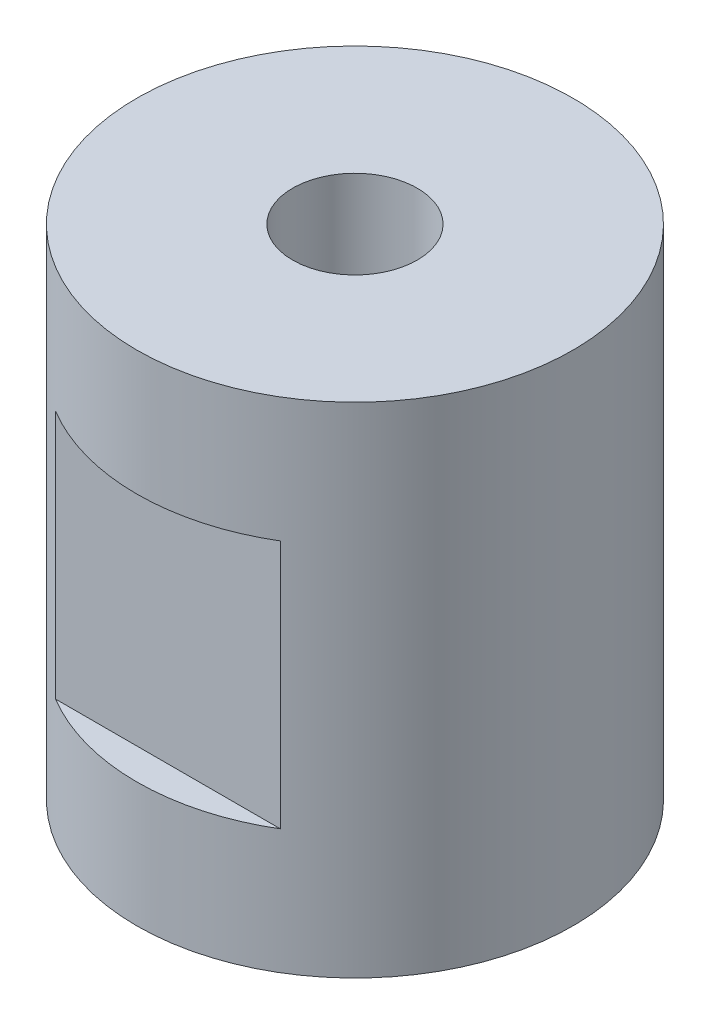
ISO-10303-21;
HEADER;
FILE_DESCRIPTION(('STEP AP214'),'2;1');
FILE_NAME('part.step','',(''),(''),'','','');
FILE_SCHEMA(('AUTOMOTIVE_DESIGN { 1 0 10303 214 1 1 1 1 }'));
ENDSEC;
DATA;
#1=APPLICATION_CONTEXT('core data for automotive mechanical design processes');
#2=APPLICATION_PROTOCOL_DEFINITION('international standard','automotive_design',2000,#1);
#3=PRODUCT_CONTEXT('',#1,'mechanical');
#4=PRODUCT('Part','Part','',(#3));
#5=PRODUCT_RELATED_PRODUCT_CATEGORY('part','',(#4));
#6=PRODUCT_DEFINITION_FORMATION('','',#4);
#7=PRODUCT_DEFINITION_CONTEXT('part definition',#1,'design');
#8=PRODUCT_DEFINITION('design','',#6,#7);
#9=PRODUCT_DEFINITION_SHAPE('','',#8);
#10=(LENGTH_UNIT() NAMED_UNIT(*) SI_UNIT(.MILLI.,.METRE.));
#11=(NAMED_UNIT(*) PLANE_ANGLE_UNIT() SI_UNIT($,.RADIAN.));
#12=(NAMED_UNIT(*) SI_UNIT($,.STERADIAN.) SOLID_ANGLE_UNIT());
#13=UNCERTAINTY_MEASURE_WITH_UNIT(LENGTH_MEASURE(1.E-05),#10,'distance_accuracy_value','');
#14=(GEOMETRIC_REPRESENTATION_CONTEXT(3) GLOBAL_UNCERTAINTY_ASSIGNED_CONTEXT((#13)) GLOBAL_UNIT_ASSIGNED_CONTEXT((#10,
#11,#12)) REPRESENTATION_CONTEXT('',''));
#15=CARTESIAN_POINT('',(0.,0.,0.));
#16=DIRECTION('',(0.,0.,1.));
#17=DIRECTION('',(1.,0.,0.));
#18=AXIS2_PLACEMENT_3D('',#15,#16,#17);
#19=CARTESIAN_POINT('',(0.,40.,0.));
#20=DIRECTION('',(0.,-1.,0.));
#21=DIRECTION('',(0.,0.,-1.));
#22=AXIS2_PLACEMENT_3D('',#19,#20,#21);
#23=CYLINDRICAL_SURFACE('',#22,35.);
#24=DIRECTION('',(0.,-1.,0.));
#25=VECTOR('',#24,1.);
#26=CARTESIAN_POINT('',(18.0277563773199,40.,30.));
#27=LINE('',#26,#25);
#28=CARTESIAN_POINT('',(18.0277563773199,20.,30.));
#29=VERTEX_POINT('',#28);
#30=CARTESIAN_POINT('',(18.0277563773199,-20.,30.));
#31=VERTEX_POINT('',#30);
#32=EDGE_CURVE('E11',#29,#31,#27,.T.);
#33=ORIENTED_EDGE('',*,*,#32,.T.);
#34=CARTESIAN_POINT('',(0.,-20.,0.));
#35=DIRECTION('',(0.,-1.,0.));
#36=DIRECTION('',(0.,0.,-1.));
#37=AXIS2_PLACEMENT_3D('',#34,#35,#36);
#38=CIRCLE('',#37,35.);
#39=CARTESIAN_POINT('',(-18.0277563773199,-20.,30.));
#40=VERTEX_POINT('',#39);
#41=EDGE_CURVE('E90',#31,#40,#38,.T.);
#42=ORIENTED_EDGE('',*,*,#41,.T.);
#43=DIRECTION('',(0.,-1.,0.));
#44=VECTOR('',#43,1.);
#45=CARTESIAN_POINT('',(-18.0277563773199,40.,30.));
#46=LINE('',#45,#44);
#47=CARTESIAN_POINT('',(-18.0277563773199,20.,30.));
#48=VERTEX_POINT('',#47);
#49=EDGE_CURVE('E40',#40,#48,#46,.F.);
#50=ORIENTED_EDGE('',*,*,#49,.T.);
#51=CARTESIAN_POINT('',(0.,20.,0.));
#52=DIRECTION('',(0.,1.,0.));
#53=DIRECTION('',(0.,0.,1.));
#54=AXIS2_PLACEMENT_3D('',#51,#52,#53);
#55=CIRCLE('',#54,35.);
#56=EDGE_CURVE('E96',#48,#29,#55,.T.);
#57=ORIENTED_EDGE('',*,*,#56,.T.);
#58=EDGE_LOOP('',(#33,#42,#50,#57));
#59=FACE_BOUND('',#58,.T.);
#60=DIRECTION('',(0.,-1.,0.));
#61=VECTOR('',#60,1.);
#62=CARTESIAN_POINT('',(-32.5001523073354,40.,-12.99));
#63=LINE('',#62,#61);
#64=CARTESIAN_POINT('',(-32.5001523073354,-30.,-12.99));
#65=VERTEX_POINT('',#64);
#66=CARTESIAN_POINT('',(-32.5001523073354,30.,-12.99));
#67=VERTEX_POINT('',#66);
#68=EDGE_CURVE('E98',#65,#67,#63,.F.);
#69=ORIENTED_EDGE('',*,*,#68,.T.);
#70=CARTESIAN_POINT('',(0.,30.,0.));
#71=DIRECTION('',(0.,1.,0.));
#72=DIRECTION('',(0.,0.,1.));
#73=AXIS2_PLACEMENT_3D('',#70,#71,#72);
#74=CIRCLE('',#73,35.);
#75=CARTESIAN_POINT('',(-32.5001523073354,30.,12.99));
#76=VERTEX_POINT('',#75);
#77=EDGE_CURVE('E109',#67,#76,#74,.T.);
#78=ORIENTED_EDGE('',*,*,#77,.T.);
#79=DIRECTION('',(0.,-1.,0.));
#80=VECTOR('',#79,1.);
#81=CARTESIAN_POINT('',(-32.5001523073354,40.,12.99));
#82=LINE('',#81,#80);
#83=CARTESIAN_POINT('',(-32.5001523073354,-30.,12.99));
#84=VERTEX_POINT('',#83);
#85=EDGE_CURVE('E103',#76,#84,#82,.T.);
#86=ORIENTED_EDGE('',*,*,#85,.T.);
#87=CARTESIAN_POINT('',(0.,-30.,0.));
#88=DIRECTION('',(0.,-1.,0.));
#89=DIRECTION('',(0.,0.,-1.));
#90=AXIS2_PLACEMENT_3D('',#87,#88,#89);
#91=CIRCLE('',#90,35.);
#92=EDGE_CURVE('E106',#84,#65,#91,.T.);
#93=ORIENTED_EDGE('',*,*,#92,.T.);
#94=EDGE_LOOP('',(#69,#78,#86,#93));
#95=FACE_BOUND('',#94,.T.);
#96=CARTESIAN_POINT('',(0.,40.,0.));
#97=DIRECTION('',(0.,1.,0.));
#98=DIRECTION('',(0.,0.,1.));
#99=AXIS2_PLACEMENT_3D('',#96,#97,#98);
#100=CIRCLE('',#99,35.);
#101=CARTESIAN_POINT('',(0.,40.,35.));
#102=VERTEX_POINT('',#101);
#103=EDGE_CURVE('E112',#102,#102,#100,.T.);
#104=ORIENTED_EDGE('',*,*,#103,.F.);
#105=EDGE_LOOP('',(#104));
#106=FACE_BOUND('',#105,.T.);
#107=CARTESIAN_POINT('',(0.,-40.,0.));
#108=DIRECTION('',(0.,1.,0.));
#109=DIRECTION('',(0.,0.,1.));
#110=AXIS2_PLACEMENT_3D('',#107,#108,#109);
#111=CIRCLE('',#110,35.);
#112=CARTESIAN_POINT('',(0.,-40.,35.));
#113=VERTEX_POINT('',#112);
#114=EDGE_CURVE('E113',#113,#113,#111,.T.);
#115=ORIENTED_EDGE('',*,*,#114,.T.);
#116=EDGE_LOOP('',(#115));
#117=FACE_BOUND('',#116,.T.);
#118=ADVANCED_FACE('F33',(#59,#95,#106,#117),#23,.T.);
#119=CARTESIAN_POINT('',(0.,40.,0.));
#120=DIRECTION('',(0.,1.,0.));
#121=DIRECTION('',(0.,0.,1.));
#122=AXIS2_PLACEMENT_3D('',#119,#120,#121);
#123=PLANE('',#122);
#124=CARTESIAN_POINT('',(0.,40.,0.));
#125=DIRECTION('',(0.,1.,0.));
#126=DIRECTION('',(0.,0.,1.));
#127=AXIS2_PLACEMENT_3D('',#124,#125,#126);
#128=CIRCLE('',#127,10.);
#129=CARTESIAN_POINT('',(0.,40.,10.));
#130=VERTEX_POINT('',#129);
#131=EDGE_CURVE('E116',#130,#130,#128,.T.);
#132=ORIENTED_EDGE('',*,*,#131,.F.);
#133=EDGE_LOOP('',(#132));
#134=FACE_BOUND('',#133,.T.);
#135=ORIENTED_EDGE('',*,*,#103,.T.);
#136=EDGE_LOOP('',(#135));
#137=FACE_BOUND('',#136,.T.);
#138=ADVANCED_FACE('F159',(#134,#137),#123,.T.);
#139=CARTESIAN_POINT('',(0.,-40.,0.));
#140=DIRECTION('',(0.,1.,0.));
#141=DIRECTION('',(0.,0.,1.));
#142=AXIS2_PLACEMENT_3D('',#139,#140,#141);
#143=PLANE('',#142);
#144=CARTESIAN_POINT('',(0.,-40.,0.));
#145=DIRECTION('',(0.,1.,0.));
#146=DIRECTION('',(0.,0.,1.));
#147=AXIS2_PLACEMENT_3D('',#144,#145,#146);
#148=CIRCLE('',#147,10.);
#149=CARTESIAN_POINT('',(0.,-40.,10.));
#150=VERTEX_POINT('',#149);
#151=EDGE_CURVE('E121',#150,#150,#148,.T.);
#152=ORIENTED_EDGE('',*,*,#151,.T.);
#153=EDGE_LOOP('',(#152));
#154=FACE_BOUND('',#153,.T.);
#155=ORIENTED_EDGE('',*,*,#114,.F.);
#156=EDGE_LOOP('',(#155));
#157=FACE_BOUND('',#156,.T.);
#158=ADVANCED_FACE('F164',(#154,#157),#143,.F.);
#159=CARTESIAN_POINT('',(0.,-40.,0.));
#160=DIRECTION('',(0.,1.,0.));
#161=DIRECTION('',(0.,0.,1.));
#162=AXIS2_PLACEMENT_3D('',#159,#160,#161);
#163=CYLINDRICAL_SURFACE('',#162,10.);
#164=ORIENTED_EDGE('',*,*,#131,.T.);
#165=EDGE_LOOP('',(#164));
#166=FACE_BOUND('',#165,.T.);
#167=ORIENTED_EDGE('',*,*,#151,.F.);
#168=EDGE_LOOP('',(#167));
#169=FACE_BOUND('',#168,.T.);
#170=ADVANCED_FACE('F166',(#166,#169),#163,.F.);
#171=CARTESIAN_POINT('',(-32.5,-30.,12.99));
#172=DIRECTION('',(0.,0.,1.));
#173=DIRECTION('',(1.,0.,0.));
#174=AXIS2_PLACEMENT_3D('',#171,#172,#173);
#175=PLANE('',#174);
#176=DIRECTION('',(-1.,0.,0.));
#177=VECTOR('',#176,1.);
#178=CARTESIAN_POINT('',(-32.5,30.,12.99));
#179=LINE('',#178,#177);
#180=CARTESIAN_POINT('',(-32.5,30.,12.99));
#181=VERTEX_POINT('',#180);
#182=EDGE_CURVE('E55',#181,#76,#179,.T.);
#183=ORIENTED_EDGE('',*,*,#182,.F.);
#184=DIRECTION('',(0.,1.,0.));
#185=VECTOR('',#184,1.);
#186=CARTESIAN_POINT('',(-32.5,-30.,12.99));
#187=LINE('',#186,#185);
#188=CARTESIAN_POINT('',(-32.5,-30.,12.99));
#189=VERTEX_POINT('',#188);
#190=EDGE_CURVE('E93',#189,#181,#187,.T.);
#191=ORIENTED_EDGE('',*,*,#190,.F.);
#192=DIRECTION('',(-1.,0.,0.));
#193=VECTOR('',#192,1.);
#194=CARTESIAN_POINT('',(-32.5,-30.,12.99));
#195=LINE('',#194,#193);
#196=EDGE_CURVE('E124',#189,#84,#195,.T.);
#197=ORIENTED_EDGE('',*,*,#196,.T.);
#198=ORIENTED_EDGE('',*,*,#85,.F.);
#199=EDGE_LOOP('',(#183,#191,#197,#198));
#200=FACE_BOUND('',#199,.T.);
#201=ADVANCED_FACE('F150',(#200),#175,.F.);
#202=CARTESIAN_POINT('',(-32.5,-30.,-12.99));
#203=DIRECTION('',(0.,-1.,0.));
#204=DIRECTION('',(0.,0.,-1.));
#205=AXIS2_PLACEMENT_3D('',#202,#203,#204);
#206=PLANE('',#205);
#207=ORIENTED_EDGE('',*,*,#196,.F.);
#208=DIRECTION('',(0.,0.,1.));
#209=VECTOR('',#208,1.);
#210=CARTESIAN_POINT('',(-32.5,-30.,-12.99));
#211=LINE('',#210,#209);
#212=CARTESIAN_POINT('',(-32.5,-30.,-12.99));
#213=VERTEX_POINT('',#212);
#214=EDGE_CURVE('E127',#213,#189,#211,.T.);
#215=ORIENTED_EDGE('',*,*,#214,.F.);
#216=DIRECTION('',(-1.,0.,0.));
#217=VECTOR('',#216,1.);
#218=CARTESIAN_POINT('',(-32.5,-30.,-12.99));
#219=LINE('',#218,#217);
#220=EDGE_CURVE('E130',#213,#65,#219,.T.);
#221=ORIENTED_EDGE('',*,*,#220,.T.);
#222=ORIENTED_EDGE('',*,*,#92,.F.);
#223=EDGE_LOOP('',(#207,#215,#221,#222));
#224=FACE_BOUND('',#223,.T.);
#225=ADVANCED_FACE('F156',(#224),#206,.F.);
#226=CARTESIAN_POINT('',(-32.5,-30.,-12.99));
#227=DIRECTION('',(0.,0.,-1.));
#228=DIRECTION('',(-1.,0.,0.));
#229=AXIS2_PLACEMENT_3D('',#226,#227,#228);
#230=PLANE('',#229);
#231=ORIENTED_EDGE('',*,*,#220,.F.);
#232=DIRECTION('',(0.,-1.,0.));
#233=VECTOR('',#232,1.);
#234=CARTESIAN_POINT('',(-32.5,-30.,-12.99));
#235=LINE('',#234,#233);
#236=CARTESIAN_POINT('',(-32.5,30.,-12.99));
#237=VERTEX_POINT('',#236);
#238=EDGE_CURVE('E137',#237,#213,#235,.T.);
#239=ORIENTED_EDGE('',*,*,#238,.F.);
#240=DIRECTION('',(-1.,0.,0.));
#241=VECTOR('',#240,1.);
#242=CARTESIAN_POINT('',(-32.5,30.,-12.99));
#243=LINE('',#242,#241);
#244=EDGE_CURVE('E126',#237,#67,#243,.T.);
#245=ORIENTED_EDGE('',*,*,#244,.T.);
#246=ORIENTED_EDGE('',*,*,#68,.F.);
#247=EDGE_LOOP('',(#231,#239,#245,#246));
#248=FACE_BOUND('',#247,.T.);
#249=ADVANCED_FACE('F154',(#248),#230,.F.);
#250=CARTESIAN_POINT('',(-32.5,30.,-12.99));
#251=DIRECTION('',(0.,1.,0.));
#252=DIRECTION('',(0.,0.,1.));
#253=AXIS2_PLACEMENT_3D('',#250,#251,#252);
#254=PLANE('',#253);
#255=ORIENTED_EDGE('',*,*,#244,.F.);
#256=DIRECTION('',(0.,0.,-1.));
#257=VECTOR('',#256,1.);
#258=CARTESIAN_POINT('',(-32.5,30.,-12.99));
#259=LINE('',#258,#257);
#260=EDGE_CURVE('E140',#181,#237,#259,.T.);
#261=ORIENTED_EDGE('',*,*,#260,.F.);
#262=ORIENTED_EDGE('',*,*,#182,.T.);
#263=ORIENTED_EDGE('',*,*,#77,.F.);
#264=EDGE_LOOP('',(#255,#261,#262,#263));
#265=FACE_BOUND('',#264,.T.);
#266=ADVANCED_FACE('F151',(#265),#254,.F.);
#267=CARTESIAN_POINT('',(-32.5,0.,0.));
#268=DIRECTION('',(1.,0.,0.));
#269=DIRECTION('',(0.,0.,-1.));
#270=AXIS2_PLACEMENT_3D('',#267,#268,#269);
#271=PLANE('',#270);
#272=ORIENTED_EDGE('',*,*,#190,.T.);
#273=ORIENTED_EDGE('',*,*,#260,.T.);
#274=ORIENTED_EDGE('',*,*,#238,.T.);
#275=ORIENTED_EDGE('',*,*,#214,.T.);
#276=EDGE_LOOP('',(#272,#273,#274,#275));
#277=FACE_BOUND('',#276,.T.);
#278=ADVANCED_FACE('F147',(#277),#271,.F.);
#279=CARTESIAN_POINT('',(-18.03,-20.,30.));
#280=DIRECTION('',(0.,-1.,0.));
#281=DIRECTION('',(0.,0.,-1.));
#282=AXIS2_PLACEMENT_3D('',#279,#280,#281);
#283=PLANE('',#282);
#284=DIRECTION('',(1.,0.,0.));
#285=VECTOR('',#284,1.);
#286=CARTESIAN_POINT('',(-18.03,-20.,30.));
#287=LINE('',#286,#285);
#288=EDGE_CURVE('E87',#40,#31,#287,.T.);
#289=ORIENTED_EDGE('',*,*,#288,.F.);
#290=ORIENTED_EDGE('',*,*,#41,.F.);
#291=EDGE_LOOP('',(#289,#290));
#292=FACE_BOUND('',#291,.T.);
#293=ADVANCED_FACE('F92',(#292),#283,.F.);
#294=CARTESIAN_POINT('',(-18.03,20.,30.));
#295=DIRECTION('',(0.,1.,0.));
#296=DIRECTION('',(0.,0.,1.));
#297=AXIS2_PLACEMENT_3D('',#294,#295,#296);
#298=PLANE('',#297);
#299=ORIENTED_EDGE('',*,*,#56,.F.);
#300=DIRECTION('',(-1.,0.,0.));
#301=VECTOR('',#300,1.);
#302=CARTESIAN_POINT('',(-18.03,20.,30.));
#303=LINE('',#302,#301);
#304=EDGE_CURVE('E47',#29,#48,#303,.T.);
#305=ORIENTED_EDGE('',*,*,#304,.F.);
#306=EDGE_LOOP('',(#299,#305));
#307=FACE_BOUND('',#306,.T.);
#308=ADVANCED_FACE('F187',(#307),#298,.F.);
#309=CARTESIAN_POINT('',(0.,0.,30.));
#310=DIRECTION('',(0.,0.,-1.));
#311=DIRECTION('',(-1.,0.,0.));
#312=AXIS2_PLACEMENT_3D('',#309,#310,#311);
#313=PLANE('',#312);
#314=ORIENTED_EDGE('',*,*,#304,.T.);
#315=ORIENTED_EDGE('',*,*,#49,.F.);
#316=ORIENTED_EDGE('',*,*,#288,.T.);
#317=ORIENTED_EDGE('',*,*,#32,.F.);
#318=EDGE_LOOP('',(#314,#315,#316,#317));
#319=FACE_BOUND('',#318,.T.);
#320=ADVANCED_FACE('F86',(#319),#313,.F.);
#321=CLOSED_SHELL('',(#118,#138,#158,#170,#201,#225,#249,#266,#278,#293,#308,#320));
#322=MANIFOLD_SOLID_BREP('B2',#321);
#323=ADVANCED_BREP_SHAPE_REPRESENTATION('',(#18,#322),#14);
#324=SHAPE_DEFINITION_REPRESENTATION(#9,#323);
ENDSEC;
END-ISO-10303-21;
